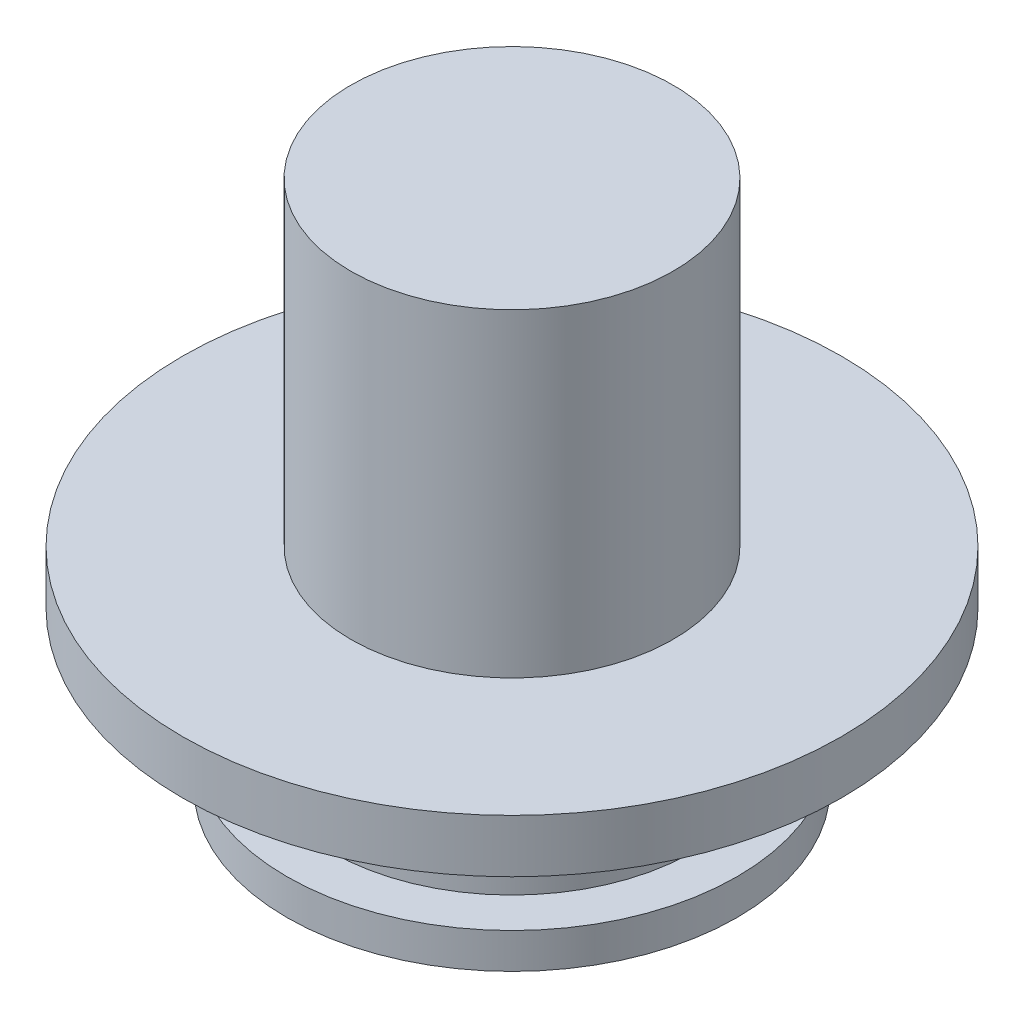
ISO-10303-21;
HEADER;
FILE_DESCRIPTION(('STEP AP214'),'2;1');
FILE_NAME('part.step','',(''),(''),'','','');
FILE_SCHEMA(('AUTOMOTIVE_DESIGN { 1 0 10303 214 1 1 1 1 }'));
ENDSEC;
DATA;
#1=APPLICATION_CONTEXT('core data for automotive mechanical design processes');
#2=APPLICATION_PROTOCOL_DEFINITION('international standard','automotive_design',2000,#1);
#3=PRODUCT_CONTEXT('',#1,'mechanical');
#4=PRODUCT('Part','Part','',(#3));
#5=PRODUCT_RELATED_PRODUCT_CATEGORY('part','',(#4));
#6=PRODUCT_DEFINITION_FORMATION('','',#4);
#7=PRODUCT_DEFINITION_CONTEXT('part definition',#1,'design');
#8=PRODUCT_DEFINITION('design','',#6,#7);
#9=PRODUCT_DEFINITION_SHAPE('','',#8);
#10=(LENGTH_UNIT() NAMED_UNIT(*) SI_UNIT(.MILLI.,.METRE.));
#11=(NAMED_UNIT(*) PLANE_ANGLE_UNIT() SI_UNIT($,.RADIAN.));
#12=(NAMED_UNIT(*) SI_UNIT($,.STERADIAN.) SOLID_ANGLE_UNIT());
#13=UNCERTAINTY_MEASURE_WITH_UNIT(LENGTH_MEASURE(1.E-05),#10,'distance_accuracy_value','');
#14=(GEOMETRIC_REPRESENTATION_CONTEXT(3) GLOBAL_UNCERTAINTY_ASSIGNED_CONTEXT((#13)) GLOBAL_UNIT_ASSIGNED_CONTEXT((#10,
#11,#12)) REPRESENTATION_CONTEXT('',''));
#15=CARTESIAN_POINT('',(0.,0.,0.));
#16=DIRECTION('',(0.,0.,1.));
#17=DIRECTION('',(1.,0.,0.));
#18=AXIS2_PLACEMENT_3D('',#15,#16,#17);
#19=CARTESIAN_POINT('',(0.,14.9,0.));
#20=DIRECTION('',(0.,-1.,0.));
#21=DIRECTION('',(0.,0.,-1.));
#22=AXIS2_PLACEMENT_3D('',#19,#20,#21);
#23=CYLINDRICAL_SURFACE('',#22,4.55);
#24=CARTESIAN_POINT('',(0.,14.9,0.));
#25=DIRECTION('',(0.,1.,0.));
#26=DIRECTION('',(0.,0.,1.));
#27=AXIS2_PLACEMENT_3D('',#24,#25,#26);
#28=CIRCLE('',#27,4.55);
#29=CARTESIAN_POINT('',(0.,14.9,4.55));
#30=VERTEX_POINT('',#29);
#31=EDGE_CURVE('E11',#30,#30,#28,.T.);
#32=ORIENTED_EDGE('',*,*,#31,.F.);
#33=EDGE_LOOP('',(#32));
#34=FACE_BOUND('',#33,.T.);
#35=CARTESIAN_POINT('',(0.,5.9,0.));
#36=DIRECTION('',(0.,1.,0.));
#37=DIRECTION('',(0.,0.,1.));
#38=AXIS2_PLACEMENT_3D('',#35,#36,#37);
#39=CIRCLE('',#38,4.55);
#40=CARTESIAN_POINT('',(0.,5.9,4.55));
#41=VERTEX_POINT('',#40);
#42=EDGE_CURVE('E43',#41,#41,#39,.T.);
#43=ORIENTED_EDGE('',*,*,#42,.T.);
#44=EDGE_LOOP('',(#43));
#45=FACE_BOUND('',#44,.T.);
#46=ADVANCED_FACE('F40',(#34,#45),#23,.T.);
#47=CARTESIAN_POINT('',(0.,14.9,0.));
#48=DIRECTION('',(0.,1.,0.));
#49=DIRECTION('',(0.,0.,1.));
#50=AXIS2_PLACEMENT_3D('',#47,#48,#49);
#51=PLANE('',#50);
#52=ORIENTED_EDGE('',*,*,#31,.T.);
#53=EDGE_LOOP('',(#52));
#54=FACE_BOUND('',#53,.T.);
#55=ADVANCED_FACE('F55',(#54),#51,.T.);
#56=CARTESIAN_POINT('',(0.,5.9,0.));
#57=DIRECTION('',(0.,1.,0.));
#58=DIRECTION('',(0.,0.,1.));
#59=AXIS2_PLACEMENT_3D('',#56,#57,#58);
#60=PLANE('',#59);
#61=ORIENTED_EDGE('',*,*,#42,.F.);
#62=EDGE_LOOP('',(#61));
#63=FACE_BOUND('',#62,.T.);
#64=ADVANCED_FACE('F53',(#63),#60,.F.);
#65=CLOSED_SHELL('',(#46,#55,#64));
#66=MANIFOLD_SOLID_BREP('B2',#65);
#67=CARTESIAN_POINT('',(0.,1.,0.));
#68=DIRECTION('',(0.,-1.,0.));
#69=DIRECTION('',(0.,0.,-1.));
#70=AXIS2_PLACEMENT_3D('',#67,#68,#69);
#71=CYLINDRICAL_SURFACE('',#70,6.35);
#72=CARTESIAN_POINT('',(0.,1.,0.));
#73=DIRECTION('',(0.,1.,0.));
#74=DIRECTION('',(0.,0.,1.));
#75=AXIS2_PLACEMENT_3D('',#72,#73,#74);
#76=CIRCLE('',#75,6.35);
#77=CARTESIAN_POINT('',(0.,1.,6.35));
#78=VERTEX_POINT('',#77);
#79=EDGE_CURVE('E87',#78,#78,#76,.T.);
#80=ORIENTED_EDGE('',*,*,#79,.F.);
#81=EDGE_LOOP('',(#80));
#82=FACE_BOUND('',#81,.T.);
#83=CARTESIAN_POINT('',(0.,0.,0.));
#84=DIRECTION('',(0.,1.,0.));
#85=DIRECTION('',(0.,0.,1.));
#86=AXIS2_PLACEMENT_3D('',#83,#84,#85);
#87=CIRCLE('',#86,6.35);
#88=CARTESIAN_POINT('',(0.,0.,6.35));
#89=VERTEX_POINT('',#88);
#90=EDGE_CURVE('E83',#89,#89,#87,.T.);
#91=ORIENTED_EDGE('',*,*,#90,.T.);
#92=EDGE_LOOP('',(#91));
#93=FACE_BOUND('',#92,.T.);
#94=ADVANCED_FACE('F80',(#82,#93),#71,.T.);
#95=CARTESIAN_POINT('',(0.,1.,0.));
#96=DIRECTION('',(0.,1.,0.));
#97=DIRECTION('',(0.,0.,1.));
#98=AXIS2_PLACEMENT_3D('',#95,#96,#97);
#99=PLANE('',#98);
#100=CARTESIAN_POINT('',(0.,1.,0.));
#101=DIRECTION('',(0.,1.,0.));
#102=DIRECTION('',(0.,0.,1.));
#103=AXIS2_PLACEMENT_3D('',#100,#101,#102);
#104=CIRCLE('',#103,5.12445119012758);
#105=CARTESIAN_POINT('',(0.,1.,5.12445119012758));
#106=VERTEX_POINT('',#105);
#107=EDGE_CURVE('E39',#106,#106,#104,.T.);
#108=ORIENTED_EDGE('',*,*,#107,.F.);
#109=EDGE_LOOP('',(#108));
#110=FACE_BOUND('',#109,.T.);
#111=ORIENTED_EDGE('',*,*,#79,.T.);
#112=EDGE_LOOP('',(#111));
#113=FACE_BOUND('',#112,.T.);
#114=ADVANCED_FACE('F120',(#110,#113),#99,.T.);
#115=CARTESIAN_POINT('',(0.,0.,0.));
#116=DIRECTION('',(0.,1.,0.));
#117=DIRECTION('',(0.,0.,1.));
#118=AXIS2_PLACEMENT_3D('',#115,#116,#117);
#119=PLANE('',#118);
#120=ORIENTED_EDGE('',*,*,#90,.F.);
#121=EDGE_LOOP('',(#120));
#122=FACE_BOUND('',#121,.T.);
#123=ADVANCED_FACE('F125',(#122),#119,.F.);
#124=CARTESIAN_POINT('',(0.,5.902,0.));
#125=DIRECTION('',(0.,-1.,0.));
#126=DIRECTION('',(0.,0.,-1.));
#127=AXIS2_PLACEMENT_3D('',#124,#125,#126);
#128=CYLINDRICAL_SURFACE('',#127,5.12445119012758);
#129=ORIENTED_EDGE('',*,*,#107,.T.);
#130=EDGE_LOOP('',(#129));
#131=FACE_BOUND('',#130,.T.);
#132=CARTESIAN_POINT('',(0.,4.4,0.));
#133=DIRECTION('',(0.,1.,0.));
#134=DIRECTION('',(0.,0.,1.));
#135=AXIS2_PLACEMENT_3D('',#132,#133,#134);
#136=CIRCLE('',#135,5.12445119012758);
#137=CARTESIAN_POINT('',(0.,4.4,5.12445119012758));
#138=VERTEX_POINT('',#137);
#139=EDGE_CURVE('E96',#138,#138,#136,.T.);
#140=ORIENTED_EDGE('',*,*,#139,.F.);
#141=EDGE_LOOP('',(#140));
#142=FACE_BOUND('',#141,.T.);
#143=ADVANCED_FACE('F133',(#131,#142),#128,.T.);
#144=CARTESIAN_POINT('',(0.,5.9,0.));
#145=DIRECTION('',(0.,-1.,0.));
#146=DIRECTION('',(0.,0.,-1.));
#147=AXIS2_PLACEMENT_3D('',#144,#145,#146);
#148=CYLINDRICAL_SURFACE('',#147,9.3);
#149=CARTESIAN_POINT('',(0.,5.9,0.));
#150=DIRECTION('',(0.,1.,0.));
#151=DIRECTION('',(0.,0.,1.));
#152=AXIS2_PLACEMENT_3D('',#149,#150,#151);
#153=CIRCLE('',#152,9.3);
#154=CARTESIAN_POINT('',(0.,5.9,9.3));
#155=VERTEX_POINT('',#154);
#156=EDGE_CURVE('E98',#155,#155,#153,.T.);
#157=ORIENTED_EDGE('',*,*,#156,.F.);
#158=EDGE_LOOP('',(#157));
#159=FACE_BOUND('',#158,.T.);
#160=CARTESIAN_POINT('',(0.,4.4,0.));
#161=DIRECTION('',(0.,1.,0.));
#162=DIRECTION('',(0.,0.,1.));
#163=AXIS2_PLACEMENT_3D('',#160,#161,#162);
#164=CIRCLE('',#163,9.3);
#165=CARTESIAN_POINT('',(0.,4.4,9.3));
#166=VERTEX_POINT('',#165);
#167=EDGE_CURVE('E94',#166,#166,#164,.T.);
#168=ORIENTED_EDGE('',*,*,#167,.T.);
#169=EDGE_LOOP('',(#168));
#170=FACE_BOUND('',#169,.T.);
#171=ADVANCED_FACE('F108',(#159,#170),#148,.T.);
#172=CARTESIAN_POINT('',(0.,5.9,0.));
#173=DIRECTION('',(0.,1.,0.));
#174=DIRECTION('',(0.,0.,1.));
#175=AXIS2_PLACEMENT_3D('',#172,#173,#174);
#176=PLANE('',#175);
#177=ORIENTED_EDGE('',*,*,#156,.T.);
#178=EDGE_LOOP('',(#177));
#179=FACE_BOUND('',#178,.T.);
#180=ADVANCED_FACE('F112',(#179),#176,.T.);
#181=CARTESIAN_POINT('',(0.,4.4,0.));
#182=DIRECTION('',(0.,1.,0.));
#183=DIRECTION('',(0.,0.,1.));
#184=AXIS2_PLACEMENT_3D('',#181,#182,#183);
#185=PLANE('',#184);
#186=ORIENTED_EDGE('',*,*,#139,.T.);
#187=EDGE_LOOP('',(#186));
#188=FACE_BOUND('',#187,.T.);
#189=ORIENTED_EDGE('',*,*,#167,.F.);
#190=EDGE_LOOP('',(#189));
#191=FACE_BOUND('',#190,.T.);
#192=ADVANCED_FACE('F110',(#188,#191),#185,.F.);
#193=CLOSED_SHELL('',(#94,#114,#123,#143,#171,#180,#192));
#194=MANIFOLD_SOLID_BREP('B6',#193);
#195=ADVANCED_BREP_SHAPE_REPRESENTATION('',(#18,#66,#194),#14);
#196=SHAPE_DEFINITION_REPRESENTATION(#9,#195);
ENDSEC;
END-ISO-10303-21;
